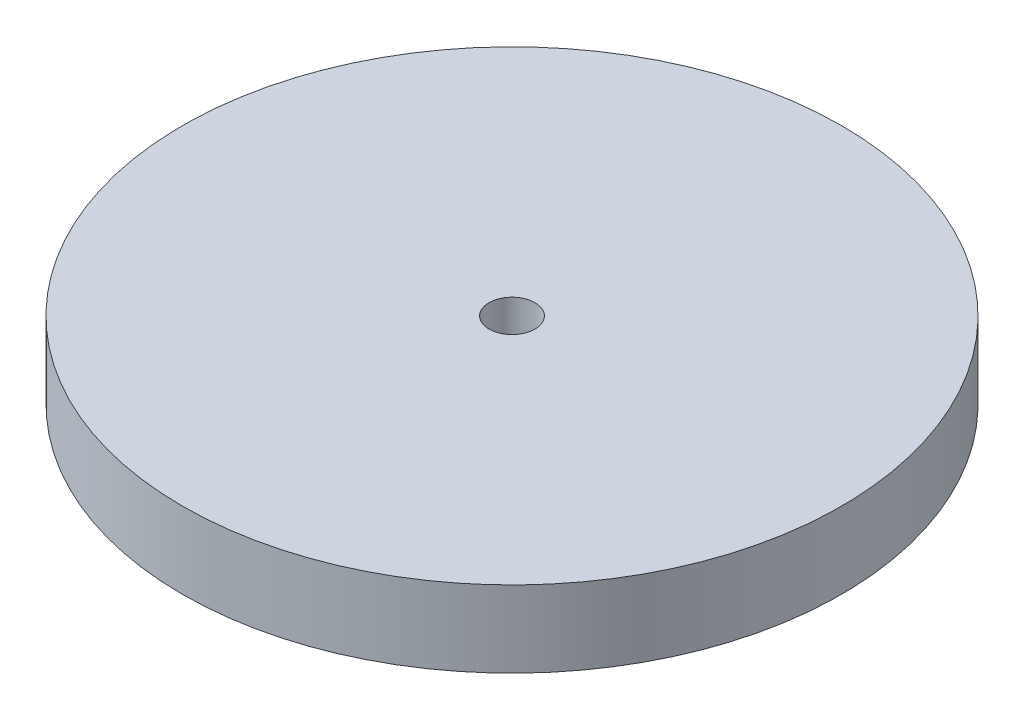
ISO-10303-21;
HEADER;
FILE_DESCRIPTION(('STEP AP214'),'2;1');
FILE_NAME('part.step','',(''),(''),'','','');
FILE_SCHEMA(('AUTOMOTIVE_DESIGN { 1 0 10303 214 1 1 1 1 }'));
ENDSEC;
DATA;
#1=APPLICATION_CONTEXT('core data for automotive mechanical design processes');
#2=APPLICATION_PROTOCOL_DEFINITION('international standard','automotive_design',2000,#1);
#3=PRODUCT_CONTEXT('',#1,'mechanical');
#4=PRODUCT('Part','Part','',(#3));
#5=PRODUCT_RELATED_PRODUCT_CATEGORY('part','',(#4));
#6=PRODUCT_DEFINITION_FORMATION('','',#4);
#7=PRODUCT_DEFINITION_CONTEXT('part definition',#1,'design');
#8=PRODUCT_DEFINITION('design','',#6,#7);
#9=PRODUCT_DEFINITION_SHAPE('','',#8);
#10=(LENGTH_UNIT() NAMED_UNIT(*) SI_UNIT(.MILLI.,.METRE.));
#11=(NAMED_UNIT(*) PLANE_ANGLE_UNIT() SI_UNIT($,.RADIAN.));
#12=(NAMED_UNIT(*) SI_UNIT($,.STERADIAN.) SOLID_ANGLE_UNIT());
#13=UNCERTAINTY_MEASURE_WITH_UNIT(LENGTH_MEASURE(1.E-05),#10,'distance_accuracy_value','');
#14=(GEOMETRIC_REPRESENTATION_CONTEXT(3) GLOBAL_UNCERTAINTY_ASSIGNED_CONTEXT((#13)) GLOBAL_UNIT_ASSIGNED_CONTEXT((#10,
#11,#12)) REPRESENTATION_CONTEXT('',''));
#15=CARTESIAN_POINT('',(0.,0.,0.));
#16=DIRECTION('',(0.,0.,1.));
#17=DIRECTION('',(1.,0.,0.));
#18=AXIS2_PLACEMENT_3D('',#15,#16,#17);
#19=CARTESIAN_POINT('',(0.,8.,0.));
#20=DIRECTION('',(0.,1.,0.));
#21=DIRECTION('',(0.,0.,1.));
#22=AXIS2_PLACEMENT_3D('',#19,#20,#21);
#23=PLANE('',#22);
#24=CARTESIAN_POINT('',(0.,8.,0.));
#25=DIRECTION('',(0.,1.,0.));
#26=DIRECTION('',(0.,0.,1.));
#27=AXIS2_PLACEMENT_3D('',#24,#25,#26);
#28=CIRCLE('',#27,34.5);
#29=CARTESIAN_POINT('',(0.,8.,34.5));
#30=VERTEX_POINT('',#29);
#31=EDGE_CURVE('E10',#30,#30,#28,.T.);
#32=ORIENTED_EDGE('',*,*,#31,.T.);
#33=EDGE_LOOP('',(#32));
#34=FACE_BOUND('',#33,.T.);
#35=CARTESIAN_POINT('',(0.,8.,0.));
#36=DIRECTION('',(0.,1.,0.));
#37=DIRECTION('',(0.,0.,1.));
#38=AXIS2_PLACEMENT_3D('',#35,#36,#37);
#39=CIRCLE('',#38,2.4);
#40=CARTESIAN_POINT('',(0.,8.,2.4));
#41=VERTEX_POINT('',#40);
#42=EDGE_CURVE('E45',#41,#41,#39,.T.);
#43=ORIENTED_EDGE('',*,*,#42,.F.);
#44=EDGE_LOOP('',(#43));
#45=FACE_BOUND('',#44,.T.);
#46=ADVANCED_FACE('F34',(#34,#45),#23,.T.);
#47=CARTESIAN_POINT('',(0.,0.,0.));
#48=DIRECTION('',(0.,1.,0.));
#49=DIRECTION('',(0.,0.,1.));
#50=AXIS2_PLACEMENT_3D('',#47,#48,#49);
#51=PLANE('',#50);
#52=CARTESIAN_POINT('',(0.,0.,0.));
#53=DIRECTION('',(0.,1.,0.));
#54=DIRECTION('',(0.,0.,1.));
#55=AXIS2_PLACEMENT_3D('',#52,#53,#54);
#56=CIRCLE('',#55,34.5);
#57=CARTESIAN_POINT('',(0.,0.,34.5));
#58=VERTEX_POINT('',#57);
#59=EDGE_CURVE('E38',#58,#58,#56,.T.);
#60=ORIENTED_EDGE('',*,*,#59,.F.);
#61=EDGE_LOOP('',(#60));
#62=FACE_BOUND('',#61,.T.);
#63=CARTESIAN_POINT('',(0.,0.,0.));
#64=DIRECTION('',(0.,1.,0.));
#65=DIRECTION('',(0.,0.,1.));
#66=AXIS2_PLACEMENT_3D('',#63,#64,#65);
#67=CIRCLE('',#66,2.4);
#68=CARTESIAN_POINT('',(0.,0.,2.4));
#69=VERTEX_POINT('',#68);
#70=EDGE_CURVE('E47',#69,#69,#67,.T.);
#71=ORIENTED_EDGE('',*,*,#70,.T.);
#72=EDGE_LOOP('',(#71));
#73=FACE_BOUND('',#72,.T.);
#74=ADVANCED_FACE('F57',(#62,#73),#51,.F.);
#75=CARTESIAN_POINT('',(0.,8.,0.));
#76=DIRECTION('',(0.,-1.,0.));
#77=DIRECTION('',(0.,0.,-1.));
#78=AXIS2_PLACEMENT_3D('',#75,#76,#77);
#79=CYLINDRICAL_SURFACE('',#78,34.5);
#80=ORIENTED_EDGE('',*,*,#31,.F.);
#81=EDGE_LOOP('',(#80));
#82=FACE_BOUND('',#81,.T.);
#83=ORIENTED_EDGE('',*,*,#59,.T.);
#84=EDGE_LOOP('',(#83));
#85=FACE_BOUND('',#84,.T.);
#86=ADVANCED_FACE('F36',(#82,#85),#79,.T.);
#87=CARTESIAN_POINT('',(0.,8.,0.));
#88=DIRECTION('',(0.,-1.,0.));
#89=DIRECTION('',(0.,0.,-1.));
#90=AXIS2_PLACEMENT_3D('',#87,#88,#89);
#91=CYLINDRICAL_SURFACE('',#90,2.4);
#92=ORIENTED_EDGE('',*,*,#42,.T.);
#93=EDGE_LOOP('',(#92));
#94=FACE_BOUND('',#93,.T.);
#95=ORIENTED_EDGE('',*,*,#70,.F.);
#96=EDGE_LOOP('',(#95));
#97=FACE_BOUND('',#96,.T.);
#98=ADVANCED_FACE('F53',(#94,#97),#91,.F.);
#99=CLOSED_SHELL('',(#46,#74,#86,#98));
#100=MANIFOLD_SOLID_BREP('B2',#99);
#101=ADVANCED_BREP_SHAPE_REPRESENTATION('',(#18,#100),#14);
#102=SHAPE_DEFINITION_REPRESENTATION(#9,#101);
ENDSEC;
END-ISO-10303-21;
